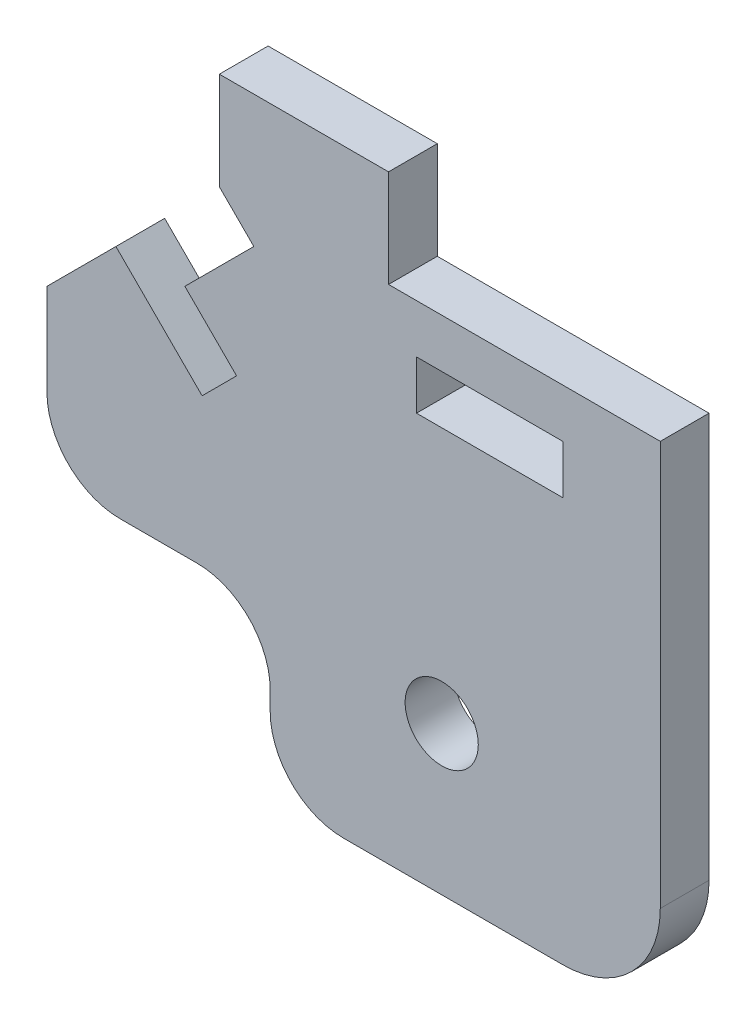
ISO-10303-21;
HEADER;
FILE_DESCRIPTION(('STEP AP214'),'2;1');
FILE_NAME('part.step','',(''),(''),'','','');
FILE_SCHEMA(('AUTOMOTIVE_DESIGN { 1 0 10303 214 1 1 1 1 }'));
ENDSEC;
DATA;
#1=APPLICATION_CONTEXT('core data for automotive mechanical design processes');
#2=APPLICATION_PROTOCOL_DEFINITION('international standard','automotive_design',2000,#1);
#3=PRODUCT_CONTEXT('',#1,'mechanical');
#4=PRODUCT('Part','Part','',(#3));
#5=PRODUCT_RELATED_PRODUCT_CATEGORY('part','',(#4));
#6=PRODUCT_DEFINITION_FORMATION('','',#4);
#7=PRODUCT_DEFINITION_CONTEXT('part definition',#1,'design');
#8=PRODUCT_DEFINITION('design','',#6,#7);
#9=PRODUCT_DEFINITION_SHAPE('','',#8);
#10=(LENGTH_UNIT() NAMED_UNIT(*) SI_UNIT(.MILLI.,.METRE.));
#11=(NAMED_UNIT(*) PLANE_ANGLE_UNIT() SI_UNIT($,.RADIAN.));
#12=(NAMED_UNIT(*) SI_UNIT($,.STERADIAN.) SOLID_ANGLE_UNIT());
#13=UNCERTAINTY_MEASURE_WITH_UNIT(LENGTH_MEASURE(1.E-05),#10,'distance_accuracy_value','');
#14=(GEOMETRIC_REPRESENTATION_CONTEXT(3) GLOBAL_UNCERTAINTY_ASSIGNED_CONTEXT((#13)) GLOBAL_UNIT_ASSIGNED_CONTEXT((#10,
#11,#12)) REPRESENTATION_CONTEXT('',''));
#15=CARTESIAN_POINT('',(0.,0.,0.));
#16=DIRECTION('',(0.,0.,1.));
#17=DIRECTION('',(1.,0.,0.));
#18=AXIS2_PLACEMENT_3D('',#15,#16,#17);
#19=CARTESIAN_POINT('',(1979.19562772419,1162.71370032791,2.));
#20=DIRECTION('',(0.,0.,1.));
#21=DIRECTION('',(1.,0.,0.));
#22=AXIS2_PLACEMENT_3D('',#19,#20,#21);
#23=PLANE('',#22);
#24=CARTESIAN_POINT('',(1974.230460889,1164.79611656245,2.));
#25=DIRECTION('',(0.,0.,1.));
#26=DIRECTION('',(1.,0.,0.));
#27=AXIS2_PLACEMENT_3D('',#24,#25,#26);
#28=CIRCLE('',#27,1.50000000000006);
#29=CARTESIAN_POINT('',(1975.730460889,1164.79611656245,2.));
#30=VERTEX_POINT('',#29);
#31=EDGE_CURVE('E223',#30,#30,#28,.T.);
#32=ORIENTED_EDGE('',*,*,#31,.F.);
#33=EDGE_LOOP('',(#32));
#34=FACE_BOUND('',#33,.T.);
#35=CARTESIAN_POINT('',(1979.19562772419,1162.71370032791,2.));
#36=DIRECTION('',(0.,0.,1.));
#37=DIRECTION('',(1.,0.,0.));
#38=AXIS2_PLACEMENT_3D('',#35,#36,#37);
#39=CIRCLE('',#38,3.99999999999989);
#40=CARTESIAN_POINT('',(1979.19562772419,1158.71370032791,2.));
#41=VERTEX_POINT('',#40);
#42=CARTESIAN_POINT('',(1983.19562772419,1162.71370032791,2.));
#43=VERTEX_POINT('',#42);
#44=EDGE_CURVE('E229',#41,#43,#39,.T.);
#45=ORIENTED_EDGE('',*,*,#44,.T.);
#46=DIRECTION('',(0.,1.,0.));
#47=VECTOR('',#46,1.);
#48=CARTESIAN_POINT('',(1983.19562772419,1179.30481038146,2.));
#49=LINE('',#48,#47);
#50=CARTESIAN_POINT('',(1983.19562772419,1179.30481038146,2.));
#51=VERTEX_POINT('',#50);
#52=EDGE_CURVE('E232',#43,#51,#49,.T.);
#53=ORIENTED_EDGE('',*,*,#52,.T.);
#54=DIRECTION('',(-1.,0.,0.));
#55=VECTOR('',#54,1.);
#56=CARTESIAN_POINT('',(1972.04918111479,1179.30481038146,2.));
#57=LINE('',#56,#55);
#58=CARTESIAN_POINT('',(1972.04918111479,1179.30481038146,2.));
#59=VERTEX_POINT('',#58);
#60=EDGE_CURVE('E235',#51,#59,#57,.T.);
#61=ORIENTED_EDGE('',*,*,#60,.T.);
#62=DIRECTION('',(0.,1.,0.));
#63=VECTOR('',#62,1.);
#64=CARTESIAN_POINT('',(1972.04918111479,1179.30481038146,2.));
#65=LINE('',#64,#63);
#66=CARTESIAN_POINT('',(1972.04918111479,1183.30481038146,2.));
#67=VERTEX_POINT('',#66);
#68=EDGE_CURVE('E237',#59,#67,#65,.T.);
#69=ORIENTED_EDGE('',*,*,#68,.T.);
#70=DIRECTION('',(-1.,0.,0.));
#71=VECTOR('',#70,1.);
#72=CARTESIAN_POINT('',(1965.10984128657,1183.30481038146,2.));
#73=LINE('',#72,#71);
#74=CARTESIAN_POINT('',(1965.10984128657,1183.30481038146,2.));
#75=VERTEX_POINT('',#74);
#76=EDGE_CURVE('E239',#67,#75,#73,.T.);
#77=ORIENTED_EDGE('',*,*,#76,.T.);
#78=DIRECTION('',(0.,-1.,0.));
#79=VECTOR('',#78,1.);
#80=CARTESIAN_POINT('',(1965.10984128657,1179.30481038146,2.));
#81=LINE('',#80,#79);
#82=CARTESIAN_POINT('',(1965.10984128657,1179.30481038146,2.));
#83=VERTEX_POINT('',#82);
#84=EDGE_CURVE('E241',#75,#83,#81,.T.);
#85=ORIENTED_EDGE('',*,*,#84,.T.);
#86=DIRECTION('',(0.707106781186492,-0.707106781186603,0.));
#87=VECTOR('',#86,1.);
#88=CARTESIAN_POINT('',(1966.52405484894,1177.89059681909,2.));
#89=LINE('',#88,#87);
#90=CARTESIAN_POINT('',(1966.52405484894,1177.89059681909,2.));
#91=VERTEX_POINT('',#90);
#92=EDGE_CURVE('E243',#83,#91,#89,.T.);
#93=ORIENTED_EDGE('',*,*,#92,.T.);
#94=DIRECTION('',(-0.707106781186325,-0.70710678118677,0.));
#95=VECTOR('',#94,1.);
#96=CARTESIAN_POINT('',(1963.69562772419,1175.06216969434,2.));
#97=LINE('',#96,#95);
#98=CARTESIAN_POINT('',(1963.69562772419,1175.06216969434,2.));
#99=VERTEX_POINT('',#98);
#100=EDGE_CURVE('E245',#91,#99,#97,.T.);
#101=ORIENTED_EDGE('',*,*,#100,.T.);
#102=DIRECTION('',(0.707106781186622,-0.707106781186474,0.));
#103=VECTOR('',#102,1.);
#104=CARTESIAN_POINT('',(1965.81694806775,1172.94084935079,2.));
#105=LINE('',#104,#103);
#106=CARTESIAN_POINT('',(1965.81694806775,1172.94084935079,2.));
#107=VERTEX_POINT('',#106);
#108=EDGE_CURVE('E247',#99,#107,#105,.T.);
#109=ORIENTED_EDGE('',*,*,#108,.T.);
#110=DIRECTION('',(-0.707106781186659,-0.707106781186437,0.));
#111=VECTOR('',#110,1.);
#112=CARTESIAN_POINT('',(1964.40273450538,1171.52663578841,2.));
#113=LINE('',#112,#111);
#114=CARTESIAN_POINT('',(1964.40273450538,1171.52663578841,2.));
#115=VERTEX_POINT('',#114);
#116=EDGE_CURVE('E249',#107,#115,#113,.T.);
#117=ORIENTED_EDGE('',*,*,#116,.T.);
#118=DIRECTION('',(-0.707106781186503,0.707106781186592,0.));
#119=VECTOR('',#118,1.);
#120=CARTESIAN_POINT('',(1964.40273450538,1171.52663578841,2.));
#121=LINE('',#120,#119);
#122=CARTESIAN_POINT('',(1960.86720059945,1175.06216969435,2.));
#123=VERTEX_POINT('',#122);
#124=EDGE_CURVE('E251',#115,#123,#121,.T.);
#125=ORIENTED_EDGE('',*,*,#124,.T.);
#126=DIRECTION('',(-0.70710678118652,-0.707106781186575,0.));
#127=VECTOR('',#126,1.);
#128=CARTESIAN_POINT('',(1960.86720059945,1175.06216969435,2.));
#129=LINE('',#128,#127);
#130=CARTESIAN_POINT('',(1958.0387734747,1172.2337425696,2.));
#131=VERTEX_POINT('',#130);
#132=EDGE_CURVE('E253',#123,#131,#129,.T.);
#133=ORIENTED_EDGE('',*,*,#132,.T.);
#134=DIRECTION('',(0.,-1.,0.));
#135=VECTOR('',#134,1.);
#136=CARTESIAN_POINT('',(1958.0387734747,1168.47638325672,2.));
#137=LINE('',#136,#135);
#138=CARTESIAN_POINT('',(1958.0387734747,1168.47638325672,2.));
#139=VERTEX_POINT('',#138);
#140=EDGE_CURVE('E255',#131,#139,#137,.T.);
#141=ORIENTED_EDGE('',*,*,#140,.T.);
#142=CARTESIAN_POINT('',(1961.0387734747,1168.47638325672,2.));
#143=DIRECTION('',(0.,0.,1.));
#144=DIRECTION('',(1.,0.,0.));
#145=AXIS2_PLACEMENT_3D('',#142,#143,#144);
#146=CIRCLE('',#145,2.99999999999989);
#147=CARTESIAN_POINT('',(1961.0387734747,1165.47638325672,2.));
#148=VERTEX_POINT('',#147);
#149=EDGE_CURVE('E257',#139,#148,#146,.T.);
#150=ORIENTED_EDGE('',*,*,#149,.T.);
#151=DIRECTION('',(1.,0.,0.));
#152=VECTOR('',#151,1.);
#153=CARTESIAN_POINT('',(1961.0387734747,1165.47638325672,2.));
#154=LINE('',#153,#152);
#155=CARTESIAN_POINT('',(1964.19562772419,1165.47638325672,2.));
#156=VERTEX_POINT('',#155);
#157=EDGE_CURVE('E259',#148,#156,#154,.T.);
#158=ORIENTED_EDGE('',*,*,#157,.T.);
#159=CARTESIAN_POINT('',(1964.19562772419,1162.47638325672,2.));
#160=DIRECTION('',(0.,0.,-1.));
#161=DIRECTION('',(1.,0.,0.));
#162=AXIS2_PLACEMENT_3D('',#159,#160,#161);
#163=CIRCLE('',#162,3.00000000000011);
#164=CARTESIAN_POINT('',(1967.19562772419,1162.47638325672,2.));
#165=VERTEX_POINT('',#164);
#166=EDGE_CURVE('E261',#156,#165,#163,.T.);
#167=ORIENTED_EDGE('',*,*,#166,.T.);
#168=DIRECTION('',(0.,-1.,0.));
#169=VECTOR('',#168,1.);
#170=CARTESIAN_POINT('',(1967.19562772419,1161.71370032791,2.));
#171=LINE('',#170,#169);
#172=CARTESIAN_POINT('',(1967.19562772419,1161.71370032791,2.));
#173=VERTEX_POINT('',#172);
#174=EDGE_CURVE('E263',#165,#173,#171,.T.);
#175=ORIENTED_EDGE('',*,*,#174,.T.);
#176=CARTESIAN_POINT('',(1970.19562772419,1161.71370032791,2.));
#177=DIRECTION('',(0.,0.,1.));
#178=DIRECTION('',(1.,0.,0.));
#179=AXIS2_PLACEMENT_3D('',#176,#177,#178);
#180=CIRCLE('',#179,3.);
#181=CARTESIAN_POINT('',(1970.19562772419,1158.71370032791,2.));
#182=VERTEX_POINT('',#181);
#183=EDGE_CURVE('E265',#173,#182,#180,.T.);
#184=ORIENTED_EDGE('',*,*,#183,.T.);
#185=DIRECTION('',(1.,0.,0.));
#186=VECTOR('',#185,1.);
#187=CARTESIAN_POINT('',(1979.19562772419,1158.71370032791,2.));
#188=LINE('',#187,#186);
#189=EDGE_CURVE('E267',#182,#41,#188,.T.);
#190=ORIENTED_EDGE('',*,*,#189,.T.);
#191=EDGE_LOOP('',(#45,#53,#61,#69,#77,#85,#93,#101,#109,#117,#125,#133,#141,#150,#158,#167,
#175,#184,#190));
#192=FACE_BOUND('',#191,.T.);
#193=DIRECTION('',(0.,1.,0.));
#194=VECTOR('',#193,1.);
#195=CARTESIAN_POINT('',(1979.19562772419,1175.30481038147,2.));
#196=LINE('',#195,#194);
#197=CARTESIAN_POINT('',(1979.19562772419,1175.30481038147,2.));
#198=VERTEX_POINT('',#197);
#199=CARTESIAN_POINT('',(1979.19562772419,1177.30481038147,2.));
#200=VERTEX_POINT('',#199);
#201=EDGE_CURVE('E195',#198,#200,#196,.T.);
#202=ORIENTED_EDGE('',*,*,#201,.F.);
#203=DIRECTION('',(1.,0.,0.));
#204=VECTOR('',#203,1.);
#205=CARTESIAN_POINT('',(1979.19562772419,1175.30481038147,2.));
#206=LINE('',#205,#204);
#207=CARTESIAN_POINT('',(1973.19562772419,1175.30481038147,2.));
#208=VERTEX_POINT('',#207);
#209=EDGE_CURVE('E187',#208,#198,#206,.T.);
#210=ORIENTED_EDGE('',*,*,#209,.F.);
#211=DIRECTION('',(0.,-1.,0.));
#212=VECTOR('',#211,1.);
#213=CARTESIAN_POINT('',(1973.19562772419,1175.30481038147,2.));
#214=LINE('',#213,#212);
#215=CARTESIAN_POINT('',(1973.19562772419,1177.30481038147,2.));
#216=VERTEX_POINT('',#215);
#217=EDGE_CURVE('E209',#216,#208,#214,.T.);
#218=ORIENTED_EDGE('',*,*,#217,.F.);
#219=DIRECTION('',(-1.,0.,0.));
#220=VECTOR('',#219,1.);
#221=CARTESIAN_POINT('',(1973.19562772419,1177.30481038147,2.));
#222=LINE('',#221,#220);
#223=EDGE_CURVE('E207',#200,#216,#222,.T.);
#224=ORIENTED_EDGE('',*,*,#223,.F.);
#225=EDGE_LOOP('',(#202,#210,#218,#224));
#226=FACE_BOUND('',#225,.T.);
#227=ADVANCED_FACE('F32',(#34,#192,#226),#23,.T.);
#228=CARTESIAN_POINT('',(1979.19562772419,1162.71370032791,0.));
#229=DIRECTION('',(0.,0.,1.));
#230=DIRECTION('',(1.,0.,0.));
#231=AXIS2_PLACEMENT_3D('',#228,#229,#230);
#232=PLANE('',#231);
#233=CARTESIAN_POINT('',(1974.230460889,1164.79611656245,0.));
#234=DIRECTION('',(0.,0.,1.));
#235=DIRECTION('',(1.,0.,0.));
#236=AXIS2_PLACEMENT_3D('',#233,#234,#235);
#237=CIRCLE('',#236,1.50000000000006);
#238=CARTESIAN_POINT('',(1975.730460889,1164.79611656245,0.));
#239=VERTEX_POINT('',#238);
#240=EDGE_CURVE('E203',#239,#239,#237,.T.);
#241=ORIENTED_EDGE('',*,*,#240,.T.);
#242=EDGE_LOOP('',(#241));
#243=FACE_BOUND('',#242,.T.);
#244=CARTESIAN_POINT('',(1979.19562772419,1162.71370032791,0.));
#245=DIRECTION('',(0.,0.,1.));
#246=DIRECTION('',(1.,0.,0.));
#247=AXIS2_PLACEMENT_3D('',#244,#245,#246);
#248=CIRCLE('',#247,3.99999999999989);
#249=CARTESIAN_POINT('',(1979.19562772419,1158.71370032791,0.));
#250=VERTEX_POINT('',#249);
#251=CARTESIAN_POINT('',(1983.19562772419,1162.71370032791,0.));
#252=VERTEX_POINT('',#251);
#253=EDGE_CURVE('E226',#250,#252,#248,.T.);
#254=ORIENTED_EDGE('',*,*,#253,.F.);
#255=DIRECTION('',(1.,0.,0.));
#256=VECTOR('',#255,1.);
#257=CARTESIAN_POINT('',(1979.19562772419,1158.71370032791,0.));
#258=LINE('',#257,#256);
#259=CARTESIAN_POINT('',(1970.19562772419,1158.71370032791,0.));
#260=VERTEX_POINT('',#259);
#261=EDGE_CURVE('E233',#260,#250,#258,.T.);
#262=ORIENTED_EDGE('',*,*,#261,.F.);
#263=CARTESIAN_POINT('',(1970.19562772419,1161.71370032791,0.));
#264=DIRECTION('',(0.,0.,1.));
#265=DIRECTION('',(1.,0.,0.));
#266=AXIS2_PLACEMENT_3D('',#263,#264,#265);
#267=CIRCLE('',#266,3.);
#268=CARTESIAN_POINT('',(1967.19562772419,1161.71370032791,0.));
#269=VERTEX_POINT('',#268);
#270=EDGE_CURVE('E305',#269,#260,#267,.T.);
#271=ORIENTED_EDGE('',*,*,#270,.F.);
#272=DIRECTION('',(0.,-1.,0.));
#273=VECTOR('',#272,1.);
#274=CARTESIAN_POINT('',(1967.19562772419,1161.71370032791,0.));
#275=LINE('',#274,#273);
#276=CARTESIAN_POINT('',(1967.19562772419,1162.47638325672,0.));
#277=VERTEX_POINT('',#276);
#278=EDGE_CURVE('E303',#277,#269,#275,.T.);
#279=ORIENTED_EDGE('',*,*,#278,.F.);
#280=CARTESIAN_POINT('',(1964.19562772419,1162.47638325672,0.));
#281=DIRECTION('',(0.,0.,-1.));
#282=DIRECTION('',(1.,0.,0.));
#283=AXIS2_PLACEMENT_3D('',#280,#281,#282);
#284=CIRCLE('',#283,3.00000000000011);
#285=CARTESIAN_POINT('',(1964.19562772419,1165.47638325672,0.));
#286=VERTEX_POINT('',#285);
#287=EDGE_CURVE('E301',#286,#277,#284,.T.);
#288=ORIENTED_EDGE('',*,*,#287,.F.);
#289=DIRECTION('',(1.,0.,0.));
#290=VECTOR('',#289,1.);
#291=CARTESIAN_POINT('',(1964.19562772419,1165.47638325672,0.));
#292=LINE('',#291,#290);
#293=CARTESIAN_POINT('',(1961.0387734747,1165.47638325672,0.));
#294=VERTEX_POINT('',#293);
#295=EDGE_CURVE('E299',#294,#286,#292,.T.);
#296=ORIENTED_EDGE('',*,*,#295,.F.);
#297=CARTESIAN_POINT('',(1961.0387734747,1168.47638325672,0.));
#298=DIRECTION('',(0.,0.,1.));
#299=DIRECTION('',(1.,0.,0.));
#300=AXIS2_PLACEMENT_3D('',#297,#298,#299);
#301=CIRCLE('',#300,2.99999999999989);
#302=CARTESIAN_POINT('',(1958.0387734747,1168.47638325672,0.));
#303=VERTEX_POINT('',#302);
#304=EDGE_CURVE('E296',#303,#294,#301,.T.);
#305=ORIENTED_EDGE('',*,*,#304,.F.);
#306=DIRECTION('',(0.,-1.,0.));
#307=VECTOR('',#306,1.);
#308=CARTESIAN_POINT('',(1958.0387734747,1168.47638325672,0.));
#309=LINE('',#308,#307);
#310=CARTESIAN_POINT('',(1958.0387734747,1172.2337425696,0.));
#311=VERTEX_POINT('',#310);
#312=EDGE_CURVE('E294',#311,#303,#309,.T.);
#313=ORIENTED_EDGE('',*,*,#312,.F.);
#314=DIRECTION('',(-0.70710678118652,-0.707106781186575,0.));
#315=VECTOR('',#314,1.);
#316=CARTESIAN_POINT('',(1960.86720059945,1175.06216969435,0.));
#317=LINE('',#316,#315);
#318=CARTESIAN_POINT('',(1960.86720059945,1175.06216969435,0.));
#319=VERTEX_POINT('',#318);
#320=EDGE_CURVE('E292',#319,#311,#317,.T.);
#321=ORIENTED_EDGE('',*,*,#320,.F.);
#322=DIRECTION('',(-0.707106781186503,0.707106781186592,0.));
#323=VECTOR('',#322,1.);
#324=CARTESIAN_POINT('',(1964.40273450538,1171.52663578841,0.));
#325=LINE('',#324,#323);
#326=CARTESIAN_POINT('',(1964.40273450538,1171.52663578841,0.));
#327=VERTEX_POINT('',#326);
#328=EDGE_CURVE('E290',#327,#319,#325,.T.);
#329=ORIENTED_EDGE('',*,*,#328,.F.);
#330=DIRECTION('',(-0.707106781186659,-0.707106781186437,0.));
#331=VECTOR('',#330,1.);
#332=CARTESIAN_POINT('',(1964.40273450538,1171.52663578841,0.));
#333=LINE('',#332,#331);
#334=CARTESIAN_POINT('',(1965.81694806775,1172.94084935079,0.));
#335=VERTEX_POINT('',#334);
#336=EDGE_CURVE('E288',#335,#327,#333,.T.);
#337=ORIENTED_EDGE('',*,*,#336,.F.);
#338=DIRECTION('',(0.707106781186622,-0.707106781186474,0.));
#339=VECTOR('',#338,1.);
#340=CARTESIAN_POINT('',(1965.81694806775,1172.94084935079,0.));
#341=LINE('',#340,#339);
#342=CARTESIAN_POINT('',(1963.69562772419,1175.06216969434,0.));
#343=VERTEX_POINT('',#342);
#344=EDGE_CURVE('E286',#343,#335,#341,.T.);
#345=ORIENTED_EDGE('',*,*,#344,.F.);
#346=DIRECTION('',(-0.707106781186325,-0.70710678118677,0.));
#347=VECTOR('',#346,1.);
#348=CARTESIAN_POINT('',(1963.69562772419,1175.06216969434,0.));
#349=LINE('',#348,#347);
#350=CARTESIAN_POINT('',(1966.52405484894,1177.89059681909,0.));
#351=VERTEX_POINT('',#350);
#352=EDGE_CURVE('E284',#351,#343,#349,.T.);
#353=ORIENTED_EDGE('',*,*,#352,.F.);
#354=DIRECTION('',(0.707106781186492,-0.707106781186603,0.));
#355=VECTOR('',#354,1.);
#356=CARTESIAN_POINT('',(1966.52405484894,1177.89059681909,0.));
#357=LINE('',#356,#355);
#358=CARTESIAN_POINT('',(1965.10984128657,1179.30481038146,0.));
#359=VERTEX_POINT('',#358);
#360=EDGE_CURVE('E282',#359,#351,#357,.T.);
#361=ORIENTED_EDGE('',*,*,#360,.F.);
#362=DIRECTION('',(0.,-1.,0.));
#363=VECTOR('',#362,1.);
#364=CARTESIAN_POINT('',(1965.10984128657,1179.30481038146,0.));
#365=LINE('',#364,#363);
#366=CARTESIAN_POINT('',(1965.10984128657,1183.30481038146,0.));
#367=VERTEX_POINT('',#366);
#368=EDGE_CURVE('E280',#367,#359,#365,.T.);
#369=ORIENTED_EDGE('',*,*,#368,.F.);
#370=DIRECTION('',(-1.,0.,0.));
#371=VECTOR('',#370,1.);
#372=CARTESIAN_POINT('',(1965.10984128657,1183.30481038146,0.));
#373=LINE('',#372,#371);
#374=CARTESIAN_POINT('',(1972.04918111479,1183.30481038146,0.));
#375=VERTEX_POINT('',#374);
#376=EDGE_CURVE('E278',#375,#367,#373,.T.);
#377=ORIENTED_EDGE('',*,*,#376,.F.);
#378=DIRECTION('',(0.,1.,0.));
#379=VECTOR('',#378,1.);
#380=CARTESIAN_POINT('',(1972.04918111479,1179.30481038146,0.));
#381=LINE('',#380,#379);
#382=CARTESIAN_POINT('',(1972.04918111479,1179.30481038146,0.));
#383=VERTEX_POINT('',#382);
#384=EDGE_CURVE('E276',#383,#375,#381,.T.);
#385=ORIENTED_EDGE('',*,*,#384,.F.);
#386=DIRECTION('',(-1.,0.,0.));
#387=VECTOR('',#386,1.);
#388=CARTESIAN_POINT('',(1972.04918111479,1179.30481038146,0.));
#389=LINE('',#388,#387);
#390=CARTESIAN_POINT('',(1983.19562772419,1179.30481038146,0.));
#391=VERTEX_POINT('',#390);
#392=EDGE_CURVE('E274',#391,#383,#389,.T.);
#393=ORIENTED_EDGE('',*,*,#392,.F.);
#394=DIRECTION('',(0.,1.,0.));
#395=VECTOR('',#394,1.);
#396=CARTESIAN_POINT('',(1983.19562772419,1179.30481038146,0.));
#397=LINE('',#396,#395);
#398=EDGE_CURVE('E272',#252,#391,#397,.T.);
#399=ORIENTED_EDGE('',*,*,#398,.F.);
#400=EDGE_LOOP('',(#254,#262,#271,#279,#288,#296,#305,#313,#321,#329,#337,#345,#353,#361,#369,
#377,#385,#393,#399));
#401=FACE_BOUND('',#400,.T.);
#402=DIRECTION('',(1.,0.,0.));
#403=VECTOR('',#402,1.);
#404=CARTESIAN_POINT('',(1979.19562772419,1175.30481038147,0.));
#405=LINE('',#404,#403);
#406=CARTESIAN_POINT('',(1973.19562772419,1175.30481038147,0.));
#407=VERTEX_POINT('',#406);
#408=CARTESIAN_POINT('',(1979.19562772419,1175.30481038147,0.));
#409=VERTEX_POINT('',#408);
#410=EDGE_CURVE('E55',#407,#409,#405,.T.);
#411=ORIENTED_EDGE('',*,*,#410,.T.);
#412=DIRECTION('',(0.,1.,0.));
#413=VECTOR('',#412,1.);
#414=CARTESIAN_POINT('',(1979.19562772419,1175.30481038147,0.));
#415=LINE('',#414,#413);
#416=CARTESIAN_POINT('',(1979.19562772419,1177.30481038147,0.));
#417=VERTEX_POINT('',#416);
#418=EDGE_CURVE('E202',#409,#417,#415,.T.);
#419=ORIENTED_EDGE('',*,*,#418,.T.);
#420=DIRECTION('',(-1.,0.,0.));
#421=VECTOR('',#420,1.);
#422=CARTESIAN_POINT('',(1973.19562772419,1177.30481038147,0.));
#423=LINE('',#422,#421);
#424=CARTESIAN_POINT('',(1973.19562772419,1177.30481038147,0.));
#425=VERTEX_POINT('',#424);
#426=EDGE_CURVE('E215',#417,#425,#423,.T.);
#427=ORIENTED_EDGE('',*,*,#426,.T.);
#428=DIRECTION('',(0.,-1.,0.));
#429=VECTOR('',#428,1.);
#430=CARTESIAN_POINT('',(1973.19562772419,1175.30481038147,0.));
#431=LINE('',#430,#429);
#432=EDGE_CURVE('E196',#425,#407,#431,.T.);
#433=ORIENTED_EDGE('',*,*,#432,.T.);
#434=EDGE_LOOP('',(#411,#419,#427,#433));
#435=FACE_BOUND('',#434,.T.);
#436=ADVANCED_FACE('F368',(#243,#401,#435),#232,.F.);
#437=CARTESIAN_POINT('',(1979.19562772419,1162.71370032791,2.));
#438=DIRECTION('',(0.,0.,-1.));
#439=DIRECTION('',(-1.,0.,0.));
#440=AXIS2_PLACEMENT_3D('',#437,#438,#439);
#441=CYLINDRICAL_SURFACE('',#440,3.99999999999989);
#442=ORIENTED_EDGE('',*,*,#253,.T.);
#443=DIRECTION('',(0.,0.,-1.));
#444=VECTOR('',#443,1.);
#445=CARTESIAN_POINT('',(1983.19562772419,1162.71370032791,2.));
#446=LINE('',#445,#444);
#447=EDGE_CURVE('E11',#43,#252,#446,.T.);
#448=ORIENTED_EDGE('',*,*,#447,.F.);
#449=ORIENTED_EDGE('',*,*,#44,.F.);
#450=DIRECTION('',(0.,0.,-1.));
#451=VECTOR('',#450,1.);
#452=CARTESIAN_POINT('',(1979.19562772419,1158.71370032791,2.));
#453=LINE('',#452,#451);
#454=EDGE_CURVE('E269',#41,#250,#453,.T.);
#455=ORIENTED_EDGE('',*,*,#454,.T.);
#456=EDGE_LOOP('',(#442,#448,#449,#455));
#457=FACE_BOUND('',#456,.T.);
#458=ADVANCED_FACE('F34',(#457),#441,.T.);
#459=CARTESIAN_POINT('',(1983.19562772419,1179.30481038146,2.));
#460=DIRECTION('',(-1.,0.,0.));
#461=DIRECTION('',(0.,0.,1.));
#462=AXIS2_PLACEMENT_3D('',#459,#460,#461);
#463=PLANE('',#462);
#464=ORIENTED_EDGE('',*,*,#398,.T.);
#465=DIRECTION('',(0.,0.,-1.));
#466=VECTOR('',#465,1.);
#467=CARTESIAN_POINT('',(1983.19562772419,1179.30481038146,2.));
#468=LINE('',#467,#466);
#469=EDGE_CURVE('E40',#51,#391,#468,.T.);
#470=ORIENTED_EDGE('',*,*,#469,.F.);
#471=ORIENTED_EDGE('',*,*,#52,.F.);
#472=ORIENTED_EDGE('',*,*,#447,.T.);
#473=EDGE_LOOP('',(#464,#470,#471,#472));
#474=FACE_BOUND('',#473,.T.);
#475=ADVANCED_FACE('F385',(#474),#463,.F.);
#476=CARTESIAN_POINT('',(1972.04918111479,1179.30481038146,2.));
#477=DIRECTION('',(0.,-1.,0.));
#478=DIRECTION('',(1.,0.,0.));
#479=AXIS2_PLACEMENT_3D('',#476,#477,#478);
#480=PLANE('',#479);
#481=ORIENTED_EDGE('',*,*,#392,.T.);
#482=DIRECTION('',(0.,0.,-1.));
#483=VECTOR('',#482,1.);
#484=CARTESIAN_POINT('',(1972.04918111479,1179.30481038146,2.));
#485=LINE('',#484,#483);
#486=EDGE_CURVE('E355',#59,#383,#485,.T.);
#487=ORIENTED_EDGE('',*,*,#486,.F.);
#488=ORIENTED_EDGE('',*,*,#60,.F.);
#489=ORIENTED_EDGE('',*,*,#469,.T.);
#490=EDGE_LOOP('',(#481,#487,#488,#489));
#491=FACE_BOUND('',#490,.T.);
#492=ADVANCED_FACE('F362',(#491),#480,.F.);
#493=CARTESIAN_POINT('',(1972.04918111479,1179.30481038146,2.));
#494=DIRECTION('',(-1.,0.,0.));
#495=DIRECTION('',(0.,0.,1.));
#496=AXIS2_PLACEMENT_3D('',#493,#494,#495);
#497=PLANE('',#496);
#498=ORIENTED_EDGE('',*,*,#384,.T.);
#499=DIRECTION('',(0.,0.,-1.));
#500=VECTOR('',#499,1.);
#501=CARTESIAN_POINT('',(1972.04918111479,1183.30481038146,2.));
#502=LINE('',#501,#500);
#503=EDGE_CURVE('E352',#67,#375,#502,.T.);
#504=ORIENTED_EDGE('',*,*,#503,.F.);
#505=ORIENTED_EDGE('',*,*,#68,.F.);
#506=ORIENTED_EDGE('',*,*,#486,.T.);
#507=EDGE_LOOP('',(#498,#504,#505,#506));
#508=FACE_BOUND('',#507,.T.);
#509=ADVANCED_FACE('F374',(#508),#497,.F.);
#510=CARTESIAN_POINT('',(1965.10984128657,1183.30481038146,2.));
#511=DIRECTION('',(0.,-1.,0.));
#512=DIRECTION('',(1.,0.,0.));
#513=AXIS2_PLACEMENT_3D('',#510,#511,#512);
#514=PLANE('',#513);
#515=ORIENTED_EDGE('',*,*,#376,.T.);
#516=DIRECTION('',(0.,0.,-1.));
#517=VECTOR('',#516,1.);
#518=CARTESIAN_POINT('',(1965.10984128657,1183.30481038146,2.));
#519=LINE('',#518,#517);
#520=EDGE_CURVE('E349',#75,#367,#519,.T.);
#521=ORIENTED_EDGE('',*,*,#520,.F.);
#522=ORIENTED_EDGE('',*,*,#76,.F.);
#523=ORIENTED_EDGE('',*,*,#503,.T.);
#524=EDGE_LOOP('',(#515,#521,#522,#523));
#525=FACE_BOUND('',#524,.T.);
#526=ADVANCED_FACE('F378',(#525),#514,.F.);
#527=CARTESIAN_POINT('',(1965.10984128657,1179.30481038146,2.));
#528=DIRECTION('',(1.,0.,0.));
#529=DIRECTION('',(0.,0.,-1.));
#530=AXIS2_PLACEMENT_3D('',#527,#528,#529);
#531=PLANE('',#530);
#532=ORIENTED_EDGE('',*,*,#368,.T.);
#533=DIRECTION('',(0.,0.,-1.));
#534=VECTOR('',#533,1.);
#535=CARTESIAN_POINT('',(1965.10984128657,1179.30481038146,2.));
#536=LINE('',#535,#534);
#537=EDGE_CURVE('E346',#83,#359,#536,.T.);
#538=ORIENTED_EDGE('',*,*,#537,.F.);
#539=ORIENTED_EDGE('',*,*,#84,.F.);
#540=ORIENTED_EDGE('',*,*,#520,.T.);
#541=EDGE_LOOP('',(#532,#538,#539,#540));
#542=FACE_BOUND('',#541,.T.);
#543=ADVANCED_FACE('F452',(#542),#531,.F.);
#544=CARTESIAN_POINT('',(1966.52405484894,1177.89059681909,2.));
#545=DIRECTION('',(0.707106781186603,0.707106781186492,0.));
#546=DIRECTION('',(-0.707106781186492,0.707106781186603,0.));
#547=AXIS2_PLACEMENT_3D('',#544,#545,#546);
#548=PLANE('',#547);
#549=ORIENTED_EDGE('',*,*,#360,.T.);
#550=DIRECTION('',(0.,0.,-1.));
#551=VECTOR('',#550,1.);
#552=CARTESIAN_POINT('',(1966.52405484894,1177.89059681909,2.));
#553=LINE('',#552,#551);
#554=EDGE_CURVE('E343',#91,#351,#553,.T.);
#555=ORIENTED_EDGE('',*,*,#554,.F.);
#556=ORIENTED_EDGE('',*,*,#92,.F.);
#557=ORIENTED_EDGE('',*,*,#537,.T.);
#558=EDGE_LOOP('',(#549,#555,#556,#557));
#559=FACE_BOUND('',#558,.T.);
#560=ADVANCED_FACE('F449',(#559),#548,.F.);
#561=CARTESIAN_POINT('',(1963.69562772419,1175.06216969434,2.));
#562=DIRECTION('',(0.70710678118677,-0.707106781186325,0.));
#563=DIRECTION('',(0.707106781186326,0.70710678118677,0.));
#564=AXIS2_PLACEMENT_3D('',#561,#562,#563);
#565=PLANE('',#564);
#566=ORIENTED_EDGE('',*,*,#352,.T.);
#567=DIRECTION('',(0.,0.,-1.));
#568=VECTOR('',#567,1.);
#569=CARTESIAN_POINT('',(1963.69562772419,1175.06216969434,2.));
#570=LINE('',#569,#568);
#571=EDGE_CURVE('E340',#99,#343,#570,.T.);
#572=ORIENTED_EDGE('',*,*,#571,.F.);
#573=ORIENTED_EDGE('',*,*,#100,.F.);
#574=ORIENTED_EDGE('',*,*,#554,.T.);
#575=EDGE_LOOP('',(#566,#572,#573,#574));
#576=FACE_BOUND('',#575,.T.);
#577=ADVANCED_FACE('F445',(#576),#565,.F.);
#578=CARTESIAN_POINT('',(1965.81694806775,1172.94084935079,2.));
#579=DIRECTION('',(0.707106781186474,0.707106781186622,0.));
#580=DIRECTION('',(-0.707106781186622,0.707106781186474,0.));
#581=AXIS2_PLACEMENT_3D('',#578,#579,#580);
#582=PLANE('',#581);
#583=ORIENTED_EDGE('',*,*,#344,.T.);
#584=DIRECTION('',(0.,0.,-1.));
#585=VECTOR('',#584,1.);
#586=CARTESIAN_POINT('',(1965.81694806775,1172.94084935079,2.));
#587=LINE('',#586,#585);
#588=EDGE_CURVE('E337',#107,#335,#587,.T.);
#589=ORIENTED_EDGE('',*,*,#588,.F.);
#590=ORIENTED_EDGE('',*,*,#108,.F.);
#591=ORIENTED_EDGE('',*,*,#571,.T.);
#592=EDGE_LOOP('',(#583,#589,#590,#591));
#593=FACE_BOUND('',#592,.T.);
#594=ADVANCED_FACE('F441',(#593),#582,.F.);
#595=CARTESIAN_POINT('',(1964.40273450538,1171.52663578841,2.));
#596=DIRECTION('',(0.707106781186437,-0.707106781186659,0.));
#597=DIRECTION('',(0.707106781186659,0.707106781186437,0.));
#598=AXIS2_PLACEMENT_3D('',#595,#596,#597);
#599=PLANE('',#598);
#600=ORIENTED_EDGE('',*,*,#336,.T.);
#601=DIRECTION('',(0.,0.,-1.));
#602=VECTOR('',#601,1.);
#603=CARTESIAN_POINT('',(1964.40273450538,1171.52663578841,2.));
#604=LINE('',#603,#602);
#605=EDGE_CURVE('E334',#115,#327,#604,.T.);
#606=ORIENTED_EDGE('',*,*,#605,.F.);
#607=ORIENTED_EDGE('',*,*,#116,.F.);
#608=ORIENTED_EDGE('',*,*,#588,.T.);
#609=EDGE_LOOP('',(#600,#606,#607,#608));
#610=FACE_BOUND('',#609,.T.);
#611=ADVANCED_FACE('F436',(#610),#599,.F.);
#612=CARTESIAN_POINT('',(1964.40273450538,1171.52663578841,2.));
#613=DIRECTION('',(-0.707106781186592,-0.707106781186503,0.));
#614=DIRECTION('',(0.707106781186503,-0.707106781186592,0.));
#615=AXIS2_PLACEMENT_3D('',#612,#613,#614);
#616=PLANE('',#615);
#617=ORIENTED_EDGE('',*,*,#328,.T.);
#618=DIRECTION('',(0.,0.,-1.));
#619=VECTOR('',#618,1.);
#620=CARTESIAN_POINT('',(1960.86720059945,1175.06216969435,2.));
#621=LINE('',#620,#619);
#622=EDGE_CURVE('E331',#123,#319,#621,.T.);
#623=ORIENTED_EDGE('',*,*,#622,.F.);
#624=ORIENTED_EDGE('',*,*,#124,.F.);
#625=ORIENTED_EDGE('',*,*,#605,.T.);
#626=EDGE_LOOP('',(#617,#623,#624,#625));
#627=FACE_BOUND('',#626,.T.);
#628=ADVANCED_FACE('F430',(#627),#616,.F.);
#629=CARTESIAN_POINT('',(1960.86720059945,1175.06216969435,2.));
#630=DIRECTION('',(0.707106781186575,-0.70710678118652,0.));
#631=DIRECTION('',(0.70710678118652,0.707106781186575,0.));
#632=AXIS2_PLACEMENT_3D('',#629,#630,#631);
#633=PLANE('',#632);
#634=ORIENTED_EDGE('',*,*,#320,.T.);
#635=DIRECTION('',(0.,0.,-1.));
#636=VECTOR('',#635,1.);
#637=CARTESIAN_POINT('',(1958.0387734747,1172.2337425696,2.));
#638=LINE('',#637,#636);
#639=EDGE_CURVE('E328',#131,#311,#638,.T.);
#640=ORIENTED_EDGE('',*,*,#639,.F.);
#641=ORIENTED_EDGE('',*,*,#132,.F.);
#642=ORIENTED_EDGE('',*,*,#622,.T.);
#643=EDGE_LOOP('',(#634,#640,#641,#642));
#644=FACE_BOUND('',#643,.T.);
#645=ADVANCED_FACE('F426',(#644),#633,.F.);
#646=CARTESIAN_POINT('',(1958.0387734747,1168.47638325672,2.));
#647=DIRECTION('',(1.,0.,0.));
#648=DIRECTION('',(0.,0.,-1.));
#649=AXIS2_PLACEMENT_3D('',#646,#647,#648);
#650=PLANE('',#649);
#651=ORIENTED_EDGE('',*,*,#312,.T.);
#652=DIRECTION('',(0.,0.,-1.));
#653=VECTOR('',#652,1.);
#654=CARTESIAN_POINT('',(1958.0387734747,1168.47638325672,2.));
#655=LINE('',#654,#653);
#656=EDGE_CURVE('E325',#139,#303,#655,.T.);
#657=ORIENTED_EDGE('',*,*,#656,.F.);
#658=ORIENTED_EDGE('',*,*,#140,.F.);
#659=ORIENTED_EDGE('',*,*,#639,.T.);
#660=EDGE_LOOP('',(#651,#657,#658,#659));
#661=FACE_BOUND('',#660,.T.);
#662=ADVANCED_FACE('F421',(#661),#650,.F.);
#663=CARTESIAN_POINT('',(1961.0387734747,1168.47638325672,2.));
#664=DIRECTION('',(0.,0.,-1.));
#665=DIRECTION('',(-1.,0.,0.));
#666=AXIS2_PLACEMENT_3D('',#663,#664,#665);
#667=CYLINDRICAL_SURFACE('',#666,2.99999999999989);
#668=ORIENTED_EDGE('',*,*,#304,.T.);
#669=DIRECTION('',(0.,0.,-1.));
#670=VECTOR('',#669,1.);
#671=CARTESIAN_POINT('',(1961.0387734747,1165.47638325672,2.));
#672=LINE('',#671,#670);
#673=EDGE_CURVE('E322',#148,#294,#672,.T.);
#674=ORIENTED_EDGE('',*,*,#673,.F.);
#675=ORIENTED_EDGE('',*,*,#149,.F.);
#676=ORIENTED_EDGE('',*,*,#656,.T.);
#677=EDGE_LOOP('',(#668,#674,#675,#676));
#678=FACE_BOUND('',#677,.T.);
#679=ADVANCED_FACE('F415',(#678),#667,.T.);
#680=CARTESIAN_POINT('',(1964.19562772419,1165.47638325672,2.));
#681=DIRECTION('',(0.,1.,0.));
#682=DIRECTION('',(0.,0.,1.));
#683=AXIS2_PLACEMENT_3D('',#680,#681,#682);
#684=PLANE('',#683);
#685=ORIENTED_EDGE('',*,*,#295,.T.);
#686=DIRECTION('',(0.,0.,-1.));
#687=VECTOR('',#686,1.);
#688=CARTESIAN_POINT('',(1964.19562772419,1165.47638325672,2.));
#689=LINE('',#688,#687);
#690=EDGE_CURVE('E319',#156,#286,#689,.T.);
#691=ORIENTED_EDGE('',*,*,#690,.F.);
#692=ORIENTED_EDGE('',*,*,#157,.F.);
#693=ORIENTED_EDGE('',*,*,#673,.T.);
#694=EDGE_LOOP('',(#685,#691,#692,#693));
#695=FACE_BOUND('',#694,.T.);
#696=ADVANCED_FACE('F411',(#695),#684,.F.);
#697=CARTESIAN_POINT('',(1964.19562772419,1162.47638325672,2.));
#698=DIRECTION('',(0.,0.,-1.));
#699=DIRECTION('',(-1.,0.,0.));
#700=AXIS2_PLACEMENT_3D('',#697,#698,#699);
#701=CYLINDRICAL_SURFACE('',#700,3.00000000000011);
#702=ORIENTED_EDGE('',*,*,#287,.T.);
#703=DIRECTION('',(0.,0.,-1.));
#704=VECTOR('',#703,1.);
#705=CARTESIAN_POINT('',(1967.19562772419,1162.47638325672,2.));
#706=LINE('',#705,#704);
#707=EDGE_CURVE('E316',#165,#277,#706,.T.);
#708=ORIENTED_EDGE('',*,*,#707,.F.);
#709=ORIENTED_EDGE('',*,*,#166,.F.);
#710=ORIENTED_EDGE('',*,*,#690,.T.);
#711=EDGE_LOOP('',(#702,#708,#709,#710));
#712=FACE_BOUND('',#711,.T.);
#713=ADVANCED_FACE('F406',(#712),#701,.F.);
#714=CARTESIAN_POINT('',(1967.19562772419,1161.71370032791,2.));
#715=DIRECTION('',(1.,0.,0.));
#716=DIRECTION('',(0.,0.,-1.));
#717=AXIS2_PLACEMENT_3D('',#714,#715,#716);
#718=PLANE('',#717);
#719=ORIENTED_EDGE('',*,*,#278,.T.);
#720=DIRECTION('',(0.,0.,-1.));
#721=VECTOR('',#720,1.);
#722=CARTESIAN_POINT('',(1967.19562772419,1161.71370032791,2.));
#723=LINE('',#722,#721);
#724=EDGE_CURVE('E313',#173,#269,#723,.T.);
#725=ORIENTED_EDGE('',*,*,#724,.F.);
#726=ORIENTED_EDGE('',*,*,#174,.F.);
#727=ORIENTED_EDGE('',*,*,#707,.T.);
#728=EDGE_LOOP('',(#719,#725,#726,#727));
#729=FACE_BOUND('',#728,.T.);
#730=ADVANCED_FACE('F401',(#729),#718,.F.);
#731=CARTESIAN_POINT('',(1970.19562772419,1161.71370032791,2.));
#732=DIRECTION('',(0.,0.,-1.));
#733=DIRECTION('',(-1.,0.,0.));
#734=AXIS2_PLACEMENT_3D('',#731,#732,#733);
#735=CYLINDRICAL_SURFACE('',#734,3.);
#736=ORIENTED_EDGE('',*,*,#270,.T.);
#737=DIRECTION('',(0.,0.,-1.));
#738=VECTOR('',#737,1.);
#739=CARTESIAN_POINT('',(1970.19562772419,1158.71370032791,2.));
#740=LINE('',#739,#738);
#741=EDGE_CURVE('E310',#182,#260,#740,.T.);
#742=ORIENTED_EDGE('',*,*,#741,.F.);
#743=ORIENTED_EDGE('',*,*,#183,.F.);
#744=ORIENTED_EDGE('',*,*,#724,.T.);
#745=EDGE_LOOP('',(#736,#742,#743,#744));
#746=FACE_BOUND('',#745,.T.);
#747=ADVANCED_FACE('F397',(#746),#735,.T.);
#748=CARTESIAN_POINT('',(1979.19562772419,1158.71370032791,2.));
#749=DIRECTION('',(0.,1.,0.));
#750=DIRECTION('',(0.,0.,1.));
#751=AXIS2_PLACEMENT_3D('',#748,#749,#750);
#752=PLANE('',#751);
#753=ORIENTED_EDGE('',*,*,#261,.T.);
#754=ORIENTED_EDGE('',*,*,#454,.F.);
#755=ORIENTED_EDGE('',*,*,#189,.F.);
#756=ORIENTED_EDGE('',*,*,#741,.T.);
#757=EDGE_LOOP('',(#753,#754,#755,#756));
#758=FACE_BOUND('',#757,.T.);
#759=ADVANCED_FACE('F392',(#758),#752,.F.);
#760=CARTESIAN_POINT('',(1974.230460889,1164.79611656245,2.));
#761=DIRECTION('',(0.,0.,-1.));
#762=DIRECTION('',(-1.,0.,0.));
#763=AXIS2_PLACEMENT_3D('',#760,#761,#762);
#764=CYLINDRICAL_SURFACE('',#763,1.50000000000006);
#765=ORIENTED_EDGE('',*,*,#31,.T.);
#766=EDGE_LOOP('',(#765));
#767=FACE_BOUND('',#766,.T.);
#768=ORIENTED_EDGE('',*,*,#240,.F.);
#769=EDGE_LOOP('',(#768));
#770=FACE_BOUND('',#769,.T.);
#771=ADVANCED_FACE('F471',(#767,#770),#764,.F.);
#772=CARTESIAN_POINT('',(1979.19562772419,1175.30481038147,2.));
#773=DIRECTION('',(0.,1.,0.));
#774=DIRECTION('',(0.,0.,1.));
#775=AXIS2_PLACEMENT_3D('',#772,#773,#774);
#776=PLANE('',#775);
#777=ORIENTED_EDGE('',*,*,#410,.F.);
#778=DIRECTION('',(0.,0.,-1.));
#779=VECTOR('',#778,1.);
#780=CARTESIAN_POINT('',(1973.19562772419,1175.30481038147,2.));
#781=LINE('',#780,#779);
#782=EDGE_CURVE('E191',#208,#407,#781,.T.);
#783=ORIENTED_EDGE('',*,*,#782,.F.);
#784=ORIENTED_EDGE('',*,*,#209,.T.);
#785=DIRECTION('',(0.,0.,-1.));
#786=VECTOR('',#785,1.);
#787=CARTESIAN_POINT('',(1979.19562772419,1175.30481038147,2.));
#788=LINE('',#787,#786);
#789=EDGE_CURVE('E190',#198,#409,#788,.T.);
#790=ORIENTED_EDGE('',*,*,#789,.T.);
#791=EDGE_LOOP('',(#777,#783,#784,#790));
#792=FACE_BOUND('',#791,.T.);
#793=ADVANCED_FACE('F189',(#792),#776,.T.);
#794=CARTESIAN_POINT('',(1979.19562772419,1175.30481038147,2.));
#795=DIRECTION('',(-1.,0.,0.));
#796=DIRECTION('',(0.,0.,1.));
#797=AXIS2_PLACEMENT_3D('',#794,#795,#796);
#798=PLANE('',#797);
#799=ORIENTED_EDGE('',*,*,#418,.F.);
#800=ORIENTED_EDGE('',*,*,#789,.F.);
#801=ORIENTED_EDGE('',*,*,#201,.T.);
#802=DIRECTION('',(0.,0.,-1.));
#803=VECTOR('',#802,1.);
#804=CARTESIAN_POINT('',(1979.19562772419,1177.30481038147,2.));
#805=LINE('',#804,#803);
#806=EDGE_CURVE('E204',#200,#417,#805,.T.);
#807=ORIENTED_EDGE('',*,*,#806,.T.);
#808=EDGE_LOOP('',(#799,#800,#801,#807));
#809=FACE_BOUND('',#808,.T.);
#810=ADVANCED_FACE('F199',(#809),#798,.T.);
#811=CARTESIAN_POINT('',(1973.19562772419,1177.30481038147,2.));
#812=DIRECTION('',(0.,-1.,0.));
#813=DIRECTION('',(0.,0.,-1.));
#814=AXIS2_PLACEMENT_3D('',#811,#812,#813);
#815=PLANE('',#814);
#816=ORIENTED_EDGE('',*,*,#426,.F.);
#817=ORIENTED_EDGE('',*,*,#806,.F.);
#818=ORIENTED_EDGE('',*,*,#223,.T.);
#819=DIRECTION('',(0.,0.,-1.));
#820=VECTOR('',#819,1.);
#821=CARTESIAN_POINT('',(1973.19562772419,1177.30481038147,2.));
#822=LINE('',#821,#820);
#823=EDGE_CURVE('E47',#216,#425,#822,.T.);
#824=ORIENTED_EDGE('',*,*,#823,.T.);
#825=EDGE_LOOP('',(#816,#817,#818,#824));
#826=FACE_BOUND('',#825,.T.);
#827=ADVANCED_FACE('F562',(#826),#815,.T.);
#828=CARTESIAN_POINT('',(1973.19562772419,1175.30481038147,2.));
#829=DIRECTION('',(1.,0.,0.));
#830=DIRECTION('',(0.,0.,-1.));
#831=AXIS2_PLACEMENT_3D('',#828,#829,#830);
#832=PLANE('',#831);
#833=ORIENTED_EDGE('',*,*,#432,.F.);
#834=ORIENTED_EDGE('',*,*,#823,.F.);
#835=ORIENTED_EDGE('',*,*,#217,.T.);
#836=ORIENTED_EDGE('',*,*,#782,.T.);
#837=EDGE_LOOP('',(#833,#834,#835,#836));
#838=FACE_BOUND('',#837,.T.);
#839=ADVANCED_FACE('F569',(#838),#832,.T.);
#840=CLOSED_SHELL('',(#227,#436,#458,#475,#492,#509,#526,#543,#560,#577,#594,#611,#628,#645,
#662,#679,#696,#713,#730,#747,#759,#771,#793,#810,#827,#839));
#841=MANIFOLD_SOLID_BREP('B2',#840);
#842=ADVANCED_BREP_SHAPE_REPRESENTATION('',(#18,#841),#14);
#843=SHAPE_DEFINITION_REPRESENTATION(#9,#842);
ENDSEC;
END-ISO-10303-21;
